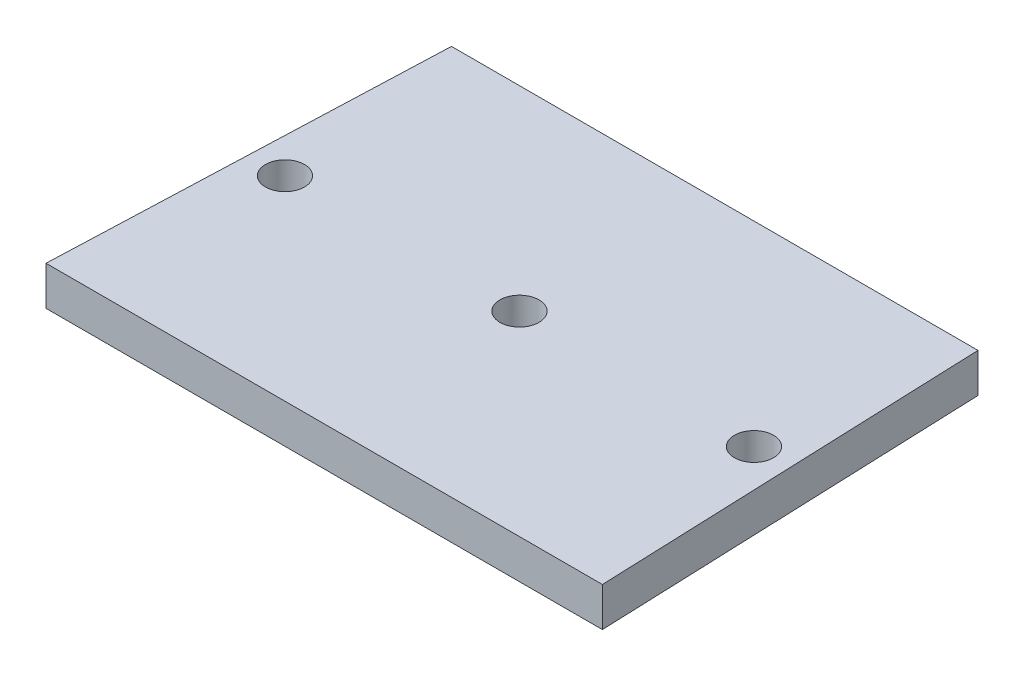
ISO-10303-21;
HEADER;
FILE_DESCRIPTION(('STEP AP214'),'2;1');
FILE_NAME('part.step','',(''),(''),'','','');
FILE_SCHEMA(('AUTOMOTIVE_DESIGN { 1 0 10303 214 1 1 1 1 }'));
ENDSEC;
DATA;
#1=APPLICATION_CONTEXT('core data for automotive mechanical design processes');
#2=APPLICATION_PROTOCOL_DEFINITION('international standard','automotive_design',2000,#1);
#3=PRODUCT_CONTEXT('',#1,'mechanical');
#4=PRODUCT('Part','Part','',(#3));
#5=PRODUCT_RELATED_PRODUCT_CATEGORY('part','',(#4));
#6=PRODUCT_DEFINITION_FORMATION('','',#4);
#7=PRODUCT_DEFINITION_CONTEXT('part definition',#1,'design');
#8=PRODUCT_DEFINITION('design','',#6,#7);
#9=PRODUCT_DEFINITION_SHAPE('','',#8);
#10=(LENGTH_UNIT() NAMED_UNIT(*) SI_UNIT(.MILLI.,.METRE.));
#11=(NAMED_UNIT(*) PLANE_ANGLE_UNIT() SI_UNIT($,.RADIAN.));
#12=(NAMED_UNIT(*) SI_UNIT($,.STERADIAN.) SOLID_ANGLE_UNIT());
#13=UNCERTAINTY_MEASURE_WITH_UNIT(LENGTH_MEASURE(1.E-05),#10,'distance_accuracy_value','');
#14=(GEOMETRIC_REPRESENTATION_CONTEXT(3) GLOBAL_UNCERTAINTY_ASSIGNED_CONTEXT((#13)) GLOBAL_UNIT_ASSIGNED_CONTEXT((#10,
#11,#12)) REPRESENTATION_CONTEXT('',''));
#15=CARTESIAN_POINT('',(0.,0.,0.));
#16=DIRECTION('',(0.,0.,1.));
#17=DIRECTION('',(1.,0.,0.));
#18=AXIS2_PLACEMENT_3D('',#15,#16,#17);
#19=CARTESIAN_POINT('',(-31.,3.,188.773821898453));
#20=DIRECTION('',(0.999268833879119,0.,0.038233462279331));
#21=DIRECTION('',(0.038233462279331,0.,-0.999268833879119));
#22=AXIS2_PLACEMENT_3D('',#19,#20,#21);
#23=PLANE('',#22);
#24=DIRECTION('',(-0.038233462279331,0.,0.999268833879119));
#25=VECTOR('',#24,1.);
#26=CARTESIAN_POINT('',(-31.,3.,188.773821898453));
#27=LINE('',#26,#25);
#28=CARTESIAN_POINT('',(-20.2079592856106,3.,-93.2866899394656));
#29=VERTEX_POINT('',#28);
#30=CARTESIAN_POINT('',(-21.3549631539906,3.,-63.308624923092));
#31=VERTEX_POINT('',#30);
#32=EDGE_CURVE('E99',#29,#31,#27,.T.);
#33=ORIENTED_EDGE('',*,*,#32,.F.);
#34=DIRECTION('',(0.,1.,0.));
#35=VECTOR('',#34,1.);
#36=CARTESIAN_POINT('',(-20.2079592856106,-15.,-93.2866899394656));
#37=LINE('',#36,#35);
#38=CARTESIAN_POINT('',(-20.2079592856106,0.,-93.2866899394656));
#39=VERTEX_POINT('',#38);
#40=EDGE_CURVE('E84',#39,#29,#37,.T.);
#41=ORIENTED_EDGE('',*,*,#40,.F.);
#42=DIRECTION('',(-0.038233462279331,0.,0.999268833879119));
#43=VECTOR('',#42,1.);
#44=CARTESIAN_POINT('',(-31.,0.,188.773821898453));
#45=LINE('',#44,#43);
#46=CARTESIAN_POINT('',(-21.3549631539906,0.,-63.308624923092));
#47=VERTEX_POINT('',#46);
#48=EDGE_CURVE('E112',#39,#47,#45,.T.);
#49=ORIENTED_EDGE('',*,*,#48,.T.);
#50=DIRECTION('',(0.,1.,0.));
#51=VECTOR('',#50,1.);
#52=CARTESIAN_POINT('',(-21.3549631539906,3.,-63.308624923092));
#53=LINE('',#52,#51);
#54=EDGE_CURVE('E68',#47,#31,#53,.T.);
#55=ORIENTED_EDGE('',*,*,#54,.T.);
#56=EDGE_LOOP('',(#33,#41,#49,#55));
#57=FACE_BOUND('',#56,.T.);
#58=ADVANCED_FACE('F46',(#57),#23,.F.);
#59=CARTESIAN_POINT('',(31.,3.,188.773821898453));
#60=DIRECTION('',(-0.999268833879119,0.,0.038233462279331));
#61=DIRECTION('',(0.038233462279331,0.,0.999268833879119));
#62=AXIS2_PLACEMENT_3D('',#59,#60,#61);
#63=PLANE('',#62);
#64=DIRECTION('',(-0.038233462279331,0.,-0.999268833879119));
#65=VECTOR('',#64,1.);
#66=CARTESIAN_POINT('',(31.,0.,188.773821898453));
#67=LINE('',#66,#65);
#68=CARTESIAN_POINT('',(21.3549631539906,0.,-63.308624923092));
#69=VERTEX_POINT('',#68);
#70=CARTESIAN_POINT('',(20.2079592856106,0.,-93.2866899394655));
#71=VERTEX_POINT('',#70);
#72=EDGE_CURVE('E106',#69,#71,#67,.T.);
#73=ORIENTED_EDGE('',*,*,#72,.T.);
#74=DIRECTION('',(0.,1.,0.));
#75=VECTOR('',#74,1.);
#76=CARTESIAN_POINT('',(20.2079592856106,-15.,-93.2866899394656));
#77=LINE('',#76,#75);
#78=CARTESIAN_POINT('',(20.2079592856106,3.,-93.2866899394656));
#79=VERTEX_POINT('',#78);
#80=EDGE_CURVE('E60',#71,#79,#77,.T.);
#81=ORIENTED_EDGE('',*,*,#80,.T.);
#82=DIRECTION('',(-0.038233462279331,0.,-0.999268833879119));
#83=VECTOR('',#82,1.);
#84=CARTESIAN_POINT('',(31.,3.,188.773821898453));
#85=LINE('',#84,#83);
#86=CARTESIAN_POINT('',(21.3549631539906,3.,-63.308624923092));
#87=VERTEX_POINT('',#86);
#88=EDGE_CURVE('E101',#87,#79,#85,.T.);
#89=ORIENTED_EDGE('',*,*,#88,.F.);
#90=DIRECTION('',(0.,-1.,0.));
#91=VECTOR('',#90,1.);
#92=CARTESIAN_POINT('',(21.3549631539906,3.,-63.308624923092));
#93=LINE('',#92,#91);
#94=EDGE_CURVE('E134',#87,#69,#93,.T.);
#95=ORIENTED_EDGE('',*,*,#94,.T.);
#96=EDGE_LOOP('',(#73,#81,#89,#95));
#97=FACE_BOUND('',#96,.T.);
#98=ADVANCED_FACE('F138',(#97),#63,.F.);
#99=CARTESIAN_POINT('',(0.,3.,0.));
#100=DIRECTION('',(0.,-1.,0.));
#101=DIRECTION('',(0.,0.,-1.));
#102=AXIS2_PLACEMENT_3D('',#99,#100,#101);
#103=PLANE('',#102);
#104=CARTESIAN_POINT('',(18.,3.,-78.2976574312788));
#105=DIRECTION('',(0.,1.,0.));
#106=DIRECTION('',(0.,0.,1.));
#107=AXIS2_PLACEMENT_3D('',#104,#105,#106);
#108=CIRCLE('',#107,1.5);
#109=CARTESIAN_POINT('',(18.,3.,-76.7976574312788));
#110=VERTEX_POINT('',#109);
#111=EDGE_CURVE('E163',#110,#110,#108,.T.);
#112=ORIENTED_EDGE('',*,*,#111,.F.);
#113=EDGE_LOOP('',(#112));
#114=FACE_BOUND('',#113,.T.);
#115=CARTESIAN_POINT('',(-18.,3.,-78.2976574312788));
#116=DIRECTION('',(0.,1.,0.));
#117=DIRECTION('',(0.,0.,1.));
#118=AXIS2_PLACEMENT_3D('',#115,#116,#117);
#119=CIRCLE('',#118,1.5);
#120=CARTESIAN_POINT('',(-18.,3.,-76.7976574312788));
#121=VERTEX_POINT('',#120);
#122=EDGE_CURVE('E160',#121,#121,#119,.T.);
#123=ORIENTED_EDGE('',*,*,#122,.F.);
#124=EDGE_LOOP('',(#123));
#125=FACE_BOUND('',#124,.T.);
#126=CARTESIAN_POINT('',(0.,3.,-78.2976574312788));
#127=DIRECTION('',(0.,1.,0.));
#128=DIRECTION('',(0.,0.,1.));
#129=AXIS2_PLACEMENT_3D('',#126,#127,#128);
#130=CIRCLE('',#129,1.5);
#131=CARTESIAN_POINT('',(0.,3.,-76.7976574312788));
#132=VERTEX_POINT('',#131);
#133=EDGE_CURVE('E115',#132,#132,#130,.T.);
#134=ORIENTED_EDGE('',*,*,#133,.F.);
#135=EDGE_LOOP('',(#134));
#136=FACE_BOUND('',#135,.T.);
#137=ORIENTED_EDGE('',*,*,#88,.T.);
#138=DIRECTION('',(1.,0.,0.));
#139=VECTOR('',#138,1.);
#140=CARTESIAN_POINT('',(-20.2079592856106,3.,-93.2866899394656));
#141=LINE('',#140,#139);
#142=EDGE_CURVE('E87',#29,#79,#141,.T.);
#143=ORIENTED_EDGE('',*,*,#142,.F.);
#144=ORIENTED_EDGE('',*,*,#32,.T.);
#145=DIRECTION('',(-1.,0.,0.));
#146=VECTOR('',#145,1.);
#147=CARTESIAN_POINT('',(-31.,3.,-63.308624923092));
#148=LINE('',#147,#146);
#149=EDGE_CURVE('E103',#87,#31,#148,.T.);
#150=ORIENTED_EDGE('',*,*,#149,.F.);
#151=EDGE_LOOP('',(#137,#143,#144,#150));
#152=FACE_BOUND('',#151,.T.);
#153=ADVANCED_FACE('F97',(#114,#125,#136,#152),#103,.F.);
#154=CARTESIAN_POINT('',(0.,0.,0.));
#155=DIRECTION('',(0.,-1.,0.));
#156=DIRECTION('',(0.,0.,-1.));
#157=AXIS2_PLACEMENT_3D('',#154,#155,#156);
#158=PLANE('',#157);
#159=DIRECTION('',(-1.,0.,0.));
#160=VECTOR('',#159,1.);
#161=CARTESIAN_POINT('',(0.,0.,-93.2866899394656));
#162=LINE('',#161,#160);
#163=EDGE_CURVE('E11',#71,#39,#162,.T.);
#164=ORIENTED_EDGE('',*,*,#163,.F.);
#165=ORIENTED_EDGE('',*,*,#72,.F.);
#166=DIRECTION('',(1.,0.,0.));
#167=VECTOR('',#166,1.);
#168=CARTESIAN_POINT('',(0.,0.,-63.308624923092));
#169=LINE('',#168,#167);
#170=EDGE_CURVE('E54',#47,#69,#169,.T.);
#171=ORIENTED_EDGE('',*,*,#170,.F.);
#172=ORIENTED_EDGE('',*,*,#48,.F.);
#173=EDGE_LOOP('',(#164,#165,#171,#172));
#174=FACE_BOUND('',#173,.T.);
#175=CARTESIAN_POINT('',(18.,0.,-78.2976574312788));
#176=DIRECTION('',(0.,-1.,0.));
#177=DIRECTION('',(0.,0.,-1.));
#178=AXIS2_PLACEMENT_3D('',#175,#176,#177);
#179=CIRCLE('',#178,1.5);
#180=CARTESIAN_POINT('',(18.,0.,-79.7976574312788));
#181=VERTEX_POINT('',#180);
#182=EDGE_CURVE('E119',#181,#181,#179,.T.);
#183=ORIENTED_EDGE('',*,*,#182,.F.);
#184=EDGE_LOOP('',(#183));
#185=FACE_BOUND('',#184,.T.);
#186=CARTESIAN_POINT('',(-18.,0.,-78.2976574312788));
#187=DIRECTION('',(0.,-1.,0.));
#188=DIRECTION('',(0.,0.,-1.));
#189=AXIS2_PLACEMENT_3D('',#186,#187,#188);
#190=CIRCLE('',#189,1.5);
#191=CARTESIAN_POINT('',(-18.,0.,-79.7976574312788));
#192=VERTEX_POINT('',#191);
#193=EDGE_CURVE('E125',#192,#192,#190,.T.);
#194=ORIENTED_EDGE('',*,*,#193,.F.);
#195=EDGE_LOOP('',(#194));
#196=FACE_BOUND('',#195,.T.);
#197=CARTESIAN_POINT('',(0.,0.,-78.2976574312788));
#198=DIRECTION('',(0.,-1.,0.));
#199=DIRECTION('',(0.,0.,-1.));
#200=AXIS2_PLACEMENT_3D('',#197,#198,#199);
#201=CIRCLE('',#200,1.5);
#202=CARTESIAN_POINT('',(0.,0.,-79.7976574312788));
#203=VERTEX_POINT('',#202);
#204=EDGE_CURVE('E121',#203,#203,#201,.T.);
#205=ORIENTED_EDGE('',*,*,#204,.F.);
#206=EDGE_LOOP('',(#205));
#207=FACE_BOUND('',#206,.T.);
#208=ADVANCED_FACE('F141',(#174,#185,#196,#207),#158,.T.);
#209=CARTESIAN_POINT('',(0.,-1.,-78.2976574312788));
#210=DIRECTION('',(0.,1.,0.));
#211=DIRECTION('',(0.,0.,1.));
#212=AXIS2_PLACEMENT_3D('',#209,#210,#211);
#213=CYLINDRICAL_SURFACE('',#212,1.5);
#214=ORIENTED_EDGE('',*,*,#204,.T.);
#215=EDGE_LOOP('',(#214));
#216=FACE_BOUND('',#215,.T.);
#217=ORIENTED_EDGE('',*,*,#133,.T.);
#218=EDGE_LOOP('',(#217));
#219=FACE_BOUND('',#218,.T.);
#220=ADVANCED_FACE('F144',(#216,#219),#213,.F.);
#221=CARTESIAN_POINT('',(-18.,-1.,-78.2976574312788));
#222=DIRECTION('',(0.,1.,0.));
#223=DIRECTION('',(0.,0.,1.));
#224=AXIS2_PLACEMENT_3D('',#221,#222,#223);
#225=CYLINDRICAL_SURFACE('',#224,1.5);
#226=ORIENTED_EDGE('',*,*,#193,.T.);
#227=EDGE_LOOP('',(#226));
#228=FACE_BOUND('',#227,.T.);
#229=ORIENTED_EDGE('',*,*,#122,.T.);
#230=EDGE_LOOP('',(#229));
#231=FACE_BOUND('',#230,.T.);
#232=ADVANCED_FACE('F154',(#228,#231),#225,.F.);
#233=CARTESIAN_POINT('',(18.,-1.,-78.2976574312788));
#234=DIRECTION('',(0.,1.,0.));
#235=DIRECTION('',(0.,0.,1.));
#236=AXIS2_PLACEMENT_3D('',#233,#234,#235);
#237=CYLINDRICAL_SURFACE('',#236,1.5);
#238=ORIENTED_EDGE('',*,*,#182,.T.);
#239=EDGE_LOOP('',(#238));
#240=FACE_BOUND('',#239,.T.);
#241=ORIENTED_EDGE('',*,*,#111,.T.);
#242=EDGE_LOOP('',(#241));
#243=FACE_BOUND('',#242,.T.);
#244=ADVANCED_FACE('F177',(#240,#243),#237,.F.);
#245=CARTESIAN_POINT('',(-31.,-15.,-63.308624923092));
#246=DIRECTION('',(0.,0.,-1.));
#247=DIRECTION('',(-1.,0.,0.));
#248=AXIS2_PLACEMENT_3D('',#245,#246,#247);
#249=PLANE('',#248);
#250=ORIENTED_EDGE('',*,*,#170,.T.);
#251=ORIENTED_EDGE('',*,*,#94,.F.);
#252=ORIENTED_EDGE('',*,*,#149,.T.);
#253=ORIENTED_EDGE('',*,*,#54,.F.);
#254=EDGE_LOOP('',(#250,#251,#252,#253));
#255=FACE_BOUND('',#254,.T.);
#256=ADVANCED_FACE('F133',(#255),#249,.F.);
#257=CARTESIAN_POINT('',(-20.2079592856106,-15.,-93.2866899394656));
#258=DIRECTION('',(0.,0.,1.));
#259=DIRECTION('',(1.,0.,0.));
#260=AXIS2_PLACEMENT_3D('',#257,#258,#259);
#261=PLANE('',#260);
#262=ORIENTED_EDGE('',*,*,#163,.T.);
#263=ORIENTED_EDGE('',*,*,#40,.T.);
#264=ORIENTED_EDGE('',*,*,#142,.T.);
#265=ORIENTED_EDGE('',*,*,#80,.F.);
#266=EDGE_LOOP('',(#262,#263,#264,#265));
#267=FACE_BOUND('',#266,.T.);
#268=ADVANCED_FACE('F86',(#267),#261,.F.);
#269=CLOSED_SHELL('',(#58,#98,#153,#208,#220,#232,#244,#256,#268));
#270=MANIFOLD_SOLID_BREP('B2',#269);
#271=ADVANCED_BREP_SHAPE_REPRESENTATION('',(#18,#270),#14);
#272=SHAPE_DEFINITION_REPRESENTATION(#9,#271);
ENDSEC;
END-ISO-10303-21;
